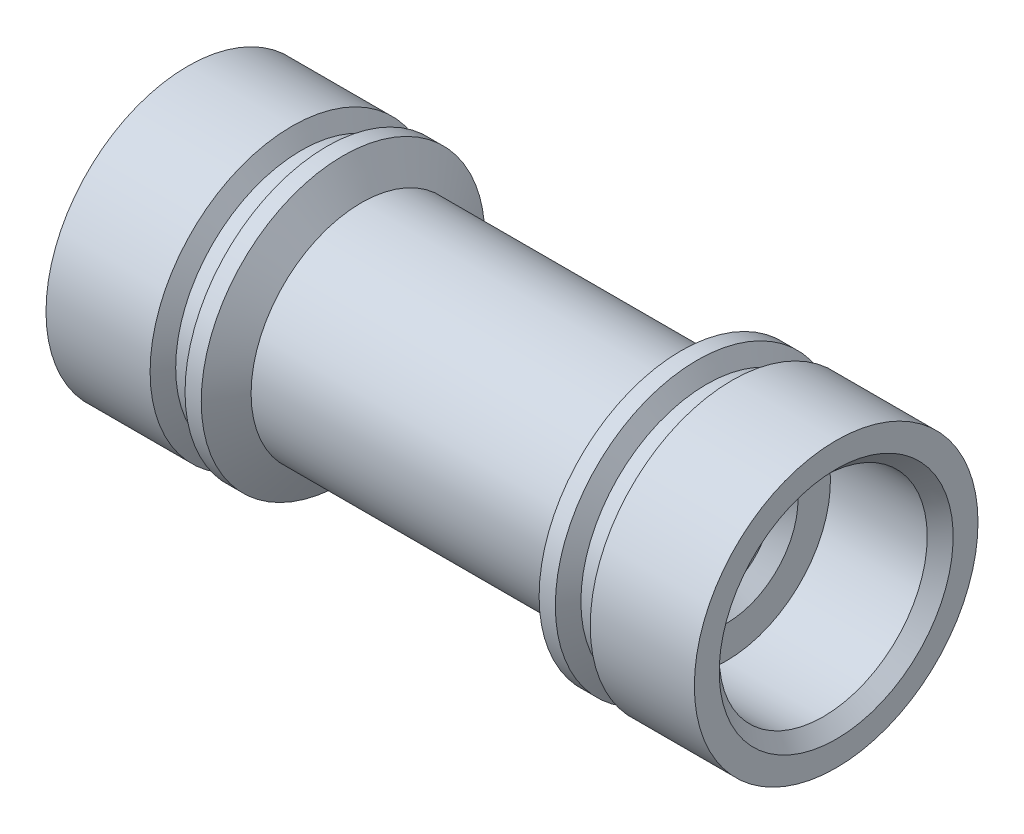
ISO-10303-21;
HEADER;
FILE_DESCRIPTION(('STEP AP214'),'2;1');
FILE_NAME('part.step','',(''),(''),'','','');
FILE_SCHEMA(('AUTOMOTIVE_DESIGN { 1 0 10303 214 1 1 1 1 }'));
ENDSEC;
DATA;
#1=APPLICATION_CONTEXT('core data for automotive mechanical design processes');
#2=APPLICATION_PROTOCOL_DEFINITION('international standard','automotive_design',2000,#1);
#3=PRODUCT_CONTEXT('',#1,'mechanical');
#4=PRODUCT('Part','Part','',(#3));
#5=PRODUCT_RELATED_PRODUCT_CATEGORY('part','',(#4));
#6=PRODUCT_DEFINITION_FORMATION('','',#4);
#7=PRODUCT_DEFINITION_CONTEXT('part definition',#1,'design');
#8=PRODUCT_DEFINITION('design','',#6,#7);
#9=PRODUCT_DEFINITION_SHAPE('','',#8);
#10=(LENGTH_UNIT() NAMED_UNIT(*) SI_UNIT(.MILLI.,.METRE.));
#11=(NAMED_UNIT(*) PLANE_ANGLE_UNIT() SI_UNIT($,.RADIAN.));
#12=(NAMED_UNIT(*) SI_UNIT($,.STERADIAN.) SOLID_ANGLE_UNIT());
#13=UNCERTAINTY_MEASURE_WITH_UNIT(LENGTH_MEASURE(1.E-05),#10,'distance_accuracy_value','');
#14=(GEOMETRIC_REPRESENTATION_CONTEXT(3) GLOBAL_UNCERTAINTY_ASSIGNED_CONTEXT((#13)) GLOBAL_UNIT_ASSIGNED_CONTEXT((#10,
#11,#12)) REPRESENTATION_CONTEXT('',''));
#15=CARTESIAN_POINT('',(0.,0.,0.));
#16=DIRECTION('',(0.,0.,1.));
#17=DIRECTION('',(1.,0.,0.));
#18=AXIS2_PLACEMENT_3D('',#15,#16,#17);
#19=CARTESIAN_POINT('',(-12.7,0.,0.));
#20=DIRECTION('',(-1.,0.,0.));
#21=DIRECTION('',(0.,-1.,0.));
#22=AXIS2_PLACEMENT_3D('',#19,#20,#21);
#23=CYLINDRICAL_SURFACE('',#22,1.905);
#24=CARTESIAN_POINT('',(-2.748,0.,0.));
#25=DIRECTION('',(-1.,0.,0.));
#26=DIRECTION('',(0.,-1.,0.));
#27=AXIS2_PLACEMENT_3D('',#24,#25,#26);
#28=CIRCLE('',#27,1.905);
#29=CARTESIAN_POINT('',(-2.748,-1.905,0.));
#30=VERTEX_POINT('',#29);
#31=EDGE_CURVE('E138',#30,#30,#28,.T.);
#32=ORIENTED_EDGE('',*,*,#31,.F.);
#33=EDGE_LOOP('',(#32));
#34=FACE_BOUND('',#33,.T.);
#35=CARTESIAN_POINT('',(-7.891999964,0.,0.));
#36=DIRECTION('',(-1.,0.,0.));
#37=DIRECTION('',(0.,-1.,0.));
#38=AXIS2_PLACEMENT_3D('',#35,#36,#37);
#39=CIRCLE('',#38,1.905);
#40=CARTESIAN_POINT('',(-7.891999964,-1.905,0.));
#41=VERTEX_POINT('',#40);
#42=EDGE_CURVE('E94',#41,#41,#39,.T.);
#43=ORIENTED_EDGE('',*,*,#42,.T.);
#44=EDGE_LOOP('',(#43));
#45=FACE_BOUND('',#44,.T.);
#46=ADVANCED_FACE('F49',(#34,#45),#23,.F.);
#47=CARTESIAN_POINT('',(-2.748,0.,0.));
#48=DIRECTION('',(-1.,0.,0.));
#49=DIRECTION('',(0.,-1.,0.));
#50=AXIS2_PLACEMENT_3D('',#47,#48,#49);
#51=CONICAL_SURFACE('',#50,1.905,0.78539816339745);
#52=CARTESIAN_POINT('',(-0.843000000000007,0.,0.));
#53=VERTEX_POINT('',#52);
#54=VERTEX_LOOP('',#53);
#55=FACE_BOUND('',#54,.T.);
#56=ORIENTED_EDGE('',*,*,#31,.T.);
#57=EDGE_LOOP('',(#56));
#58=FACE_BOUND('',#57,.T.);
#59=ADVANCED_FACE('F160',(#55,#58),#51,.F.);
#60=CARTESIAN_POINT('',(-12.7,0.,0.));
#61=DIRECTION('',(-1.,0.,0.));
#62=DIRECTION('',(0.,-1.,0.));
#63=AXIS2_PLACEMENT_3D('',#60,#61,#62);
#64=CYLINDRICAL_SURFACE('',#63,4.318);
#65=CARTESIAN_POINT('',(-5.90347860824054,0.,0.));
#66=DIRECTION('',(-1.,0.,0.));
#67=DIRECTION('',(0.,-1.,0.));
#68=AXIS2_PLACEMENT_3D('',#65,#66,#67);
#69=CIRCLE('',#68,4.318);
#70=CARTESIAN_POINT('',(-5.90347860824054,-4.318,0.));
#71=VERTEX_POINT('',#70);
#72=EDGE_CURVE('E134',#71,#71,#69,.T.);
#73=ORIENTED_EDGE('',*,*,#72,.F.);
#74=EDGE_LOOP('',(#73));
#75=FACE_BOUND('',#74,.T.);
#76=CARTESIAN_POINT('',(5.90347860824054,0.,0.));
#77=DIRECTION('',(-1.,0.,0.));
#78=DIRECTION('',(0.,-1.,0.));
#79=AXIS2_PLACEMENT_3D('',#76,#77,#78);
#80=CIRCLE('',#79,4.318);
#81=CARTESIAN_POINT('',(5.90347860824054,-4.318,0.));
#82=VERTEX_POINT('',#81);
#83=EDGE_CURVE('E77',#82,#82,#80,.T.);
#84=ORIENTED_EDGE('',*,*,#83,.T.);
#85=EDGE_LOOP('',(#84));
#86=FACE_BOUND('',#85,.T.);
#87=ADVANCED_FACE('F164',(#75,#86),#64,.T.);
#88=CARTESIAN_POINT('',(-6.61838257906459,0.,0.));
#89=DIRECTION('',(-1.,0.,0.));
#90=DIRECTION('',(0.,-1.,0.));
#91=AXIS2_PLACEMENT_3D('',#88,#89,#90);
#92=CONICAL_SURFACE('',#91,5.55625,1.0471975511966);
#93=ORIENTED_EDGE('',*,*,#72,.T.);
#94=EDGE_LOOP('',(#93));
#95=FACE_BOUND('',#94,.T.);
#96=CARTESIAN_POINT('',(-6.61838257906459,0.,0.));
#97=DIRECTION('',(-1.,0.,0.));
#98=DIRECTION('',(0.,-1.,0.));
#99=AXIS2_PLACEMENT_3D('',#96,#97,#98);
#100=CIRCLE('',#99,5.55625);
#101=CARTESIAN_POINT('',(-6.61838257906459,-5.55625,0.));
#102=VERTEX_POINT('',#101);
#103=EDGE_CURVE('E130',#102,#102,#100,.T.);
#104=ORIENTED_EDGE('',*,*,#103,.F.);
#105=EDGE_LOOP('',(#104));
#106=FACE_BOUND('',#105,.T.);
#107=ADVANCED_FACE('F171',(#95,#106),#92,.T.);
#108=CARTESIAN_POINT('',(-12.7,0.,0.));
#109=DIRECTION('',(-1.,0.,0.));
#110=DIRECTION('',(0.,-1.,0.));
#111=AXIS2_PLACEMENT_3D('',#108,#109,#110);
#112=CYLINDRICAL_SURFACE('',#111,5.55625);
#113=ORIENTED_EDGE('',*,*,#103,.T.);
#114=EDGE_LOOP('',(#113));
#115=FACE_BOUND('',#114,.T.);
#116=CARTESIAN_POINT('',(-7.25338257906459,0.,0.));
#117=DIRECTION('',(-1.,0.,0.));
#118=DIRECTION('',(0.,-1.,0.));
#119=AXIS2_PLACEMENT_3D('',#116,#117,#118);
#120=CIRCLE('',#119,5.55625);
#121=CARTESIAN_POINT('',(-7.25338257906459,-5.55625,0.));
#122=VERTEX_POINT('',#121);
#123=EDGE_CURVE('E126',#122,#122,#120,.T.);
#124=ORIENTED_EDGE('',*,*,#123,.F.);
#125=EDGE_LOOP('',(#124));
#126=FACE_BOUND('',#125,.T.);
#127=ADVANCED_FACE('F175',(#115,#126),#112,.T.);
#128=CARTESIAN_POINT('',(-7.62,0.,0.));
#129=DIRECTION('',(1.,0.,0.));
#130=DIRECTION('',(0.,1.,0.));
#131=AXIS2_PLACEMENT_3D('',#128,#129,#130);
#132=CONICAL_SURFACE('',#131,4.92125,1.0471975511966);
#133=ORIENTED_EDGE('',*,*,#123,.T.);
#134=EDGE_LOOP('',(#133));
#135=FACE_BOUND('',#134,.T.);
#136=CARTESIAN_POINT('',(-7.62,0.,0.));
#137=DIRECTION('',(-1.,0.,0.));
#138=DIRECTION('',(0.,-1.,0.));
#139=AXIS2_PLACEMENT_3D('',#136,#137,#138);
#140=CIRCLE('',#139,4.92125);
#141=CARTESIAN_POINT('',(-7.62,-4.92125,0.));
#142=VERTEX_POINT('',#141);
#143=EDGE_CURVE('E122',#142,#142,#140,.T.);
#144=ORIENTED_EDGE('',*,*,#143,.F.);
#145=EDGE_LOOP('',(#144));
#146=FACE_BOUND('',#145,.T.);
#147=ADVANCED_FACE('F179',(#135,#146),#132,.T.);
#148=CARTESIAN_POINT('',(-12.7,0.,0.));
#149=DIRECTION('',(-1.,0.,0.));
#150=DIRECTION('',(0.,-1.,0.));
#151=AXIS2_PLACEMENT_3D('',#148,#149,#150);
#152=CYLINDRICAL_SURFACE('',#151,4.92125);
#153=ORIENTED_EDGE('',*,*,#143,.T.);
#154=EDGE_LOOP('',(#153));
#155=FACE_BOUND('',#154,.T.);
#156=CARTESIAN_POINT('',(-8.255,0.,0.));
#157=DIRECTION('',(-1.,0.,0.));
#158=DIRECTION('',(0.,-1.,0.));
#159=AXIS2_PLACEMENT_3D('',#156,#157,#158);
#160=CIRCLE('',#159,4.92125);
#161=CARTESIAN_POINT('',(-8.255,-4.92125,0.));
#162=VERTEX_POINT('',#161);
#163=EDGE_CURVE('E118',#162,#162,#160,.T.);
#164=ORIENTED_EDGE('',*,*,#163,.F.);
#165=EDGE_LOOP('',(#164));
#166=FACE_BOUND('',#165,.T.);
#167=ADVANCED_FACE('F183',(#155,#166),#152,.T.);
#168=CARTESIAN_POINT('',(-8.62161742093541,0.,0.));
#169=DIRECTION('',(-1.,0.,0.));
#170=DIRECTION('',(0.,-1.,0.));
#171=AXIS2_PLACEMENT_3D('',#168,#169,#170);
#172=CONICAL_SURFACE('',#171,5.55625,1.0471975511966);
#173=ORIENTED_EDGE('',*,*,#163,.T.);
#174=EDGE_LOOP('',(#173));
#175=FACE_BOUND('',#174,.T.);
#176=CARTESIAN_POINT('',(-8.62161742093541,0.,0.));
#177=DIRECTION('',(-1.,0.,0.));
#178=DIRECTION('',(0.,-1.,0.));
#179=AXIS2_PLACEMENT_3D('',#176,#177,#178);
#180=CIRCLE('',#179,5.55625);
#181=CARTESIAN_POINT('',(-8.62161742093541,-5.55625,0.));
#182=VERTEX_POINT('',#181);
#183=EDGE_CURVE('E114',#182,#182,#180,.T.);
#184=ORIENTED_EDGE('',*,*,#183,.F.);
#185=EDGE_LOOP('',(#184));
#186=FACE_BOUND('',#185,.T.);
#187=ADVANCED_FACE('F187',(#175,#186),#172,.T.);
#188=CARTESIAN_POINT('',(-12.7,0.,0.));
#189=DIRECTION('',(-1.,0.,0.));
#190=DIRECTION('',(0.,-1.,0.));
#191=AXIS2_PLACEMENT_3D('',#188,#189,#190);
#192=CYLINDRICAL_SURFACE('',#191,5.55625);
#193=ORIENTED_EDGE('',*,*,#183,.T.);
#194=EDGE_LOOP('',(#193));
#195=FACE_BOUND('',#194,.T.);
#196=CARTESIAN_POINT('',(-12.7,0.,0.));
#197=DIRECTION('',(-1.,0.,0.));
#198=DIRECTION('',(0.,-1.,0.));
#199=AXIS2_PLACEMENT_3D('',#196,#197,#198);
#200=CIRCLE('',#199,5.55625);
#201=CARTESIAN_POINT('',(-12.7,-5.55625,0.));
#202=VERTEX_POINT('',#201);
#203=EDGE_CURVE('E110',#202,#202,#200,.T.);
#204=ORIENTED_EDGE('',*,*,#203,.F.);
#205=EDGE_LOOP('',(#204));
#206=FACE_BOUND('',#205,.T.);
#207=ADVANCED_FACE('F191',(#195,#206),#192,.T.);
#208=CARTESIAN_POINT('',(-12.7,0.,0.));
#209=DIRECTION('',(1.,0.,0.));
#210=DIRECTION('',(0.,1.,0.));
#211=AXIS2_PLACEMENT_3D('',#208,#209,#210);
#212=PLANE('',#211);
#213=CARTESIAN_POINT('',(-12.7,0.,0.));
#214=DIRECTION('',(1.,0.,0.));
#215=DIRECTION('',(0.,1.,0.));
#216=AXIS2_PLACEMENT_3D('',#213,#214,#215);
#217=CIRCLE('',#216,4.58300000000001);
#218=CARTESIAN_POINT('',(-12.7,4.58300000000001,0.));
#219=VERTEX_POINT('',#218);
#220=EDGE_CURVE('E11',#219,#219,#217,.T.);
#221=ORIENTED_EDGE('',*,*,#220,.T.);
#222=EDGE_LOOP('',(#221));
#223=FACE_BOUND('',#222,.T.);
#224=ORIENTED_EDGE('',*,*,#203,.T.);
#225=EDGE_LOOP('',(#224));
#226=FACE_BOUND('',#225,.T.);
#227=ADVANCED_FACE('F195',(#223,#226),#212,.F.);
#228=CARTESIAN_POINT('',(-12.7,0.,0.));
#229=DIRECTION('',(-1.,0.,0.));
#230=DIRECTION('',(0.,-1.,0.));
#231=AXIS2_PLACEMENT_3D('',#228,#229,#230);
#232=CYLINDRICAL_SURFACE('',#231,4.075);
#233=CARTESIAN_POINT('',(-12.192,0.,0.));
#234=DIRECTION('',(1.,0.,0.));
#235=DIRECTION('',(0.,1.,0.));
#236=AXIS2_PLACEMENT_3D('',#233,#234,#235);
#237=CIRCLE('',#236,4.075);
#238=CARTESIAN_POINT('',(-12.192,4.075,0.));
#239=VERTEX_POINT('',#238);
#240=EDGE_CURVE('E59',#239,#239,#237,.F.);
#241=ORIENTED_EDGE('',*,*,#240,.T.);
#242=EDGE_LOOP('',(#241));
#243=FACE_BOUND('',#242,.T.);
#244=CARTESIAN_POINT('',(-8.399999964,0.,0.));
#245=DIRECTION('',(-1.,0.,0.));
#246=DIRECTION('',(0.,-1.,0.));
#247=AXIS2_PLACEMENT_3D('',#244,#245,#246);
#248=CIRCLE('',#247,4.075);
#249=CARTESIAN_POINT('',(-8.399999964,-4.075,0.));
#250=VERTEX_POINT('',#249);
#251=EDGE_CURVE('E106',#250,#250,#248,.T.);
#252=ORIENTED_EDGE('',*,*,#251,.F.);
#253=EDGE_LOOP('',(#252));
#254=FACE_BOUND('',#253,.T.);
#255=ADVANCED_FACE('F145',(#243,#254),#232,.F.);
#256=CARTESIAN_POINT('',(-8.399999964,0.,0.));
#257=DIRECTION('',(1.,0.,0.));
#258=DIRECTION('',(0.,1.,0.));
#259=AXIS2_PLACEMENT_3D('',#256,#257,#258);
#260=PLANE('',#259);
#261=CARTESIAN_POINT('',(-8.399999964,0.,0.));
#262=DIRECTION('',(-1.,0.,0.));
#263=DIRECTION('',(0.,-1.,0.));
#264=AXIS2_PLACEMENT_3D('',#261,#262,#263);
#265=CIRCLE('',#264,2.805);
#266=CARTESIAN_POINT('',(-8.399999964,-2.805,0.));
#267=VERTEX_POINT('',#266);
#268=EDGE_CURVE('E102',#267,#267,#265,.T.);
#269=ORIENTED_EDGE('',*,*,#268,.F.);
#270=EDGE_LOOP('',(#269));
#271=FACE_BOUND('',#270,.T.);
#272=ORIENTED_EDGE('',*,*,#251,.T.);
#273=EDGE_LOOP('',(#272));
#274=FACE_BOUND('',#273,.T.);
#275=ADVANCED_FACE('F202',(#271,#274),#260,.F.);
#276=CARTESIAN_POINT('',(-8.399999964,0.,0.));
#277=DIRECTION('',(-1.,0.,0.));
#278=DIRECTION('',(0.,-1.,0.));
#279=AXIS2_PLACEMENT_3D('',#276,#277,#278);
#280=CONICAL_SURFACE('',#279,2.805,0.785398163397449);
#281=CARTESIAN_POINT('',(-7.891999964,0.,0.));
#282=DIRECTION('',(-1.,0.,0.));
#283=DIRECTION('',(0.,-1.,0.));
#284=AXIS2_PLACEMENT_3D('',#281,#282,#283);
#285=CIRCLE('',#284,2.297);
#286=CARTESIAN_POINT('',(-7.891999964,-2.297,0.));
#287=VERTEX_POINT('',#286);
#288=EDGE_CURVE('E98',#287,#287,#285,.T.);
#289=ORIENTED_EDGE('',*,*,#288,.F.);
#290=EDGE_LOOP('',(#289));
#291=FACE_BOUND('',#290,.T.);
#292=ORIENTED_EDGE('',*,*,#268,.T.);
#293=EDGE_LOOP('',(#292));
#294=FACE_BOUND('',#293,.T.);
#295=ADVANCED_FACE('F155',(#291,#294),#280,.F.);
#296=CARTESIAN_POINT('',(-7.891999964,0.,0.));
#297=DIRECTION('',(1.,0.,0.));
#298=DIRECTION('',(0.,1.,0.));
#299=AXIS2_PLACEMENT_3D('',#296,#297,#298);
#300=PLANE('',#299);
#301=ORIENTED_EDGE('',*,*,#42,.F.);
#302=EDGE_LOOP('',(#301));
#303=FACE_BOUND('',#302,.T.);
#304=ORIENTED_EDGE('',*,*,#288,.T.);
#305=EDGE_LOOP('',(#304));
#306=FACE_BOUND('',#305,.T.);
#307=ADVANCED_FACE('F149',(#303,#306),#300,.F.);
#308=CARTESIAN_POINT('',(-12.192,0.,0.));
#309=DIRECTION('',(-1.,0.,0.));
#310=DIRECTION('',(0.,-1.,0.));
#311=AXIS2_PLACEMENT_3D('',#308,#309,#310);
#312=CONICAL_SURFACE('',#311,4.075,0.785398163397452);
#313=ORIENTED_EDGE('',*,*,#220,.F.);
#314=EDGE_LOOP('',(#313));
#315=FACE_BOUND('',#314,.T.);
#316=ORIENTED_EDGE('',*,*,#240,.F.);
#317=EDGE_LOOP('',(#316));
#318=FACE_BOUND('',#317,.T.);
#319=ADVANCED_FACE('F52',(#315,#318),#312,.F.);
#320=CARTESIAN_POINT('',(12.7,0.,0.));
#321=DIRECTION('',(1.,0.,0.));
#322=DIRECTION('',(0.,-1.,0.));
#323=AXIS2_PLACEMENT_3D('',#320,#321,#322);
#324=CYLINDRICAL_SURFACE('',#323,1.905);
#325=CARTESIAN_POINT('',(2.748,0.,0.));
#326=DIRECTION('',(-1.,0.,0.));
#327=DIRECTION('',(0.,-1.,0.));
#328=AXIS2_PLACEMENT_3D('',#325,#326,#327);
#329=CIRCLE('',#328,1.905);
#330=CARTESIAN_POINT('',(2.748,-1.905,0.));
#331=VERTEX_POINT('',#330);
#332=EDGE_CURVE('E73',#331,#331,#329,.T.);
#333=ORIENTED_EDGE('',*,*,#332,.T.);
#334=EDGE_LOOP('',(#333));
#335=FACE_BOUND('',#334,.T.);
#336=CARTESIAN_POINT('',(7.891999964,0.,0.));
#337=DIRECTION('',(-1.,0.,0.));
#338=DIRECTION('',(0.,-1.,0.));
#339=AXIS2_PLACEMENT_3D('',#336,#337,#338);
#340=CIRCLE('',#339,1.905);
#341=CARTESIAN_POINT('',(7.891999964,-1.905,0.));
#342=VERTEX_POINT('',#341);
#343=EDGE_CURVE('E259',#342,#342,#340,.T.);
#344=ORIENTED_EDGE('',*,*,#343,.F.);
#345=EDGE_LOOP('',(#344));
#346=FACE_BOUND('',#345,.T.);
#347=ADVANCED_FACE('F69',(#335,#346),#324,.F.);
#348=CARTESIAN_POINT('',(2.748,0.,0.));
#349=DIRECTION('',(1.,0.,0.));
#350=DIRECTION('',(0.,-1.,0.));
#351=AXIS2_PLACEMENT_3D('',#348,#349,#350);
#352=CONICAL_SURFACE('',#351,1.905,0.78539816339745);
#353=CARTESIAN_POINT('',(0.843000000000007,0.,0.));
#354=VERTEX_POINT('',#353);
#355=VERTEX_LOOP('',#354);
#356=FACE_BOUND('',#355,.T.);
#357=ORIENTED_EDGE('',*,*,#332,.F.);
#358=EDGE_LOOP('',(#357));
#359=FACE_BOUND('',#358,.T.);
#360=ADVANCED_FACE('F65',(#356,#359),#352,.F.);
#361=CARTESIAN_POINT('',(6.61838257906459,0.,0.));
#362=DIRECTION('',(1.,0.,0.));
#363=DIRECTION('',(0.,-1.,0.));
#364=AXIS2_PLACEMENT_3D('',#361,#362,#363);
#365=CONICAL_SURFACE('',#364,5.55625,1.0471975511966);
#366=ORIENTED_EDGE('',*,*,#83,.F.);
#367=EDGE_LOOP('',(#366));
#368=FACE_BOUND('',#367,.T.);
#369=CARTESIAN_POINT('',(6.61838257906459,0.,0.));
#370=DIRECTION('',(-1.,0.,0.));
#371=DIRECTION('',(0.,-1.,0.));
#372=AXIS2_PLACEMENT_3D('',#369,#370,#371);
#373=CIRCLE('',#372,5.55625);
#374=CARTESIAN_POINT('',(6.61838257906459,-5.55625,0.));
#375=VERTEX_POINT('',#374);
#376=EDGE_CURVE('E87',#375,#375,#373,.T.);
#377=ORIENTED_EDGE('',*,*,#376,.T.);
#378=EDGE_LOOP('',(#377));
#379=FACE_BOUND('',#378,.T.);
#380=ADVANCED_FACE('F68',(#368,#379),#365,.T.);
#381=CARTESIAN_POINT('',(12.7,0.,0.));
#382=DIRECTION('',(1.,0.,0.));
#383=DIRECTION('',(0.,-1.,0.));
#384=AXIS2_PLACEMENT_3D('',#381,#382,#383);
#385=CYLINDRICAL_SURFACE('',#384,5.55625);
#386=ORIENTED_EDGE('',*,*,#376,.F.);
#387=EDGE_LOOP('',(#386));
#388=FACE_BOUND('',#387,.T.);
#389=CARTESIAN_POINT('',(7.25338257906459,0.,0.));
#390=DIRECTION('',(-1.,0.,0.));
#391=DIRECTION('',(0.,-1.,0.));
#392=AXIS2_PLACEMENT_3D('',#389,#390,#391);
#393=CIRCLE('',#392,5.55625);
#394=CARTESIAN_POINT('',(7.25338257906459,-5.55625,0.));
#395=VERTEX_POINT('',#394);
#396=EDGE_CURVE('E290',#395,#395,#393,.T.);
#397=ORIENTED_EDGE('',*,*,#396,.T.);
#398=EDGE_LOOP('',(#397));
#399=FACE_BOUND('',#398,.T.);
#400=ADVANCED_FACE('F216',(#388,#399),#385,.T.);
#401=CARTESIAN_POINT('',(7.62,0.,0.));
#402=DIRECTION('',(-1.,0.,0.));
#403=DIRECTION('',(0.,1.,0.));
#404=AXIS2_PLACEMENT_3D('',#401,#402,#403);
#405=CONICAL_SURFACE('',#404,4.92125,1.0471975511966);
#406=ORIENTED_EDGE('',*,*,#396,.F.);
#407=EDGE_LOOP('',(#406));
#408=FACE_BOUND('',#407,.T.);
#409=CARTESIAN_POINT('',(7.62,0.,0.));
#410=DIRECTION('',(-1.,0.,0.));
#411=DIRECTION('',(0.,-1.,0.));
#412=AXIS2_PLACEMENT_3D('',#409,#410,#411);
#413=CIRCLE('',#412,4.92125);
#414=CARTESIAN_POINT('',(7.62,-4.92125,0.));
#415=VERTEX_POINT('',#414);
#416=EDGE_CURVE('E286',#415,#415,#413,.T.);
#417=ORIENTED_EDGE('',*,*,#416,.T.);
#418=EDGE_LOOP('',(#417));
#419=FACE_BOUND('',#418,.T.);
#420=ADVANCED_FACE('F220',(#408,#419),#405,.T.);
#421=CARTESIAN_POINT('',(12.7,0.,0.));
#422=DIRECTION('',(1.,0.,0.));
#423=DIRECTION('',(0.,-1.,0.));
#424=AXIS2_PLACEMENT_3D('',#421,#422,#423);
#425=CYLINDRICAL_SURFACE('',#424,4.92125);
#426=ORIENTED_EDGE('',*,*,#416,.F.);
#427=EDGE_LOOP('',(#426));
#428=FACE_BOUND('',#427,.T.);
#429=CARTESIAN_POINT('',(8.255,0.,0.));
#430=DIRECTION('',(-1.,0.,0.));
#431=DIRECTION('',(0.,-1.,0.));
#432=AXIS2_PLACEMENT_3D('',#429,#430,#431);
#433=CIRCLE('',#432,4.92125);
#434=CARTESIAN_POINT('',(8.255,-4.92125,0.));
#435=VERTEX_POINT('',#434);
#436=EDGE_CURVE('E282',#435,#435,#433,.T.);
#437=ORIENTED_EDGE('',*,*,#436,.T.);
#438=EDGE_LOOP('',(#437));
#439=FACE_BOUND('',#438,.T.);
#440=ADVANCED_FACE('F224',(#428,#439),#425,.T.);
#441=CARTESIAN_POINT('',(8.62161742093541,0.,0.));
#442=DIRECTION('',(1.,0.,0.));
#443=DIRECTION('',(0.,-1.,0.));
#444=AXIS2_PLACEMENT_3D('',#441,#442,#443);
#445=CONICAL_SURFACE('',#444,5.55625,1.0471975511966);
#446=ORIENTED_EDGE('',*,*,#436,.F.);
#447=EDGE_LOOP('',(#446));
#448=FACE_BOUND('',#447,.T.);
#449=CARTESIAN_POINT('',(8.62161742093541,0.,0.));
#450=DIRECTION('',(-1.,0.,0.));
#451=DIRECTION('',(0.,-1.,0.));
#452=AXIS2_PLACEMENT_3D('',#449,#450,#451);
#453=CIRCLE('',#452,5.55625);
#454=CARTESIAN_POINT('',(8.62161742093541,-5.55625,0.));
#455=VERTEX_POINT('',#454);
#456=EDGE_CURVE('E279',#455,#455,#453,.T.);
#457=ORIENTED_EDGE('',*,*,#456,.T.);
#458=EDGE_LOOP('',(#457));
#459=FACE_BOUND('',#458,.T.);
#460=ADVANCED_FACE('F228',(#448,#459),#445,.T.);
#461=CARTESIAN_POINT('',(12.7,0.,0.));
#462=DIRECTION('',(1.,0.,0.));
#463=DIRECTION('',(0.,-1.,0.));
#464=AXIS2_PLACEMENT_3D('',#461,#462,#463);
#465=CYLINDRICAL_SURFACE('',#464,5.55625);
#466=ORIENTED_EDGE('',*,*,#456,.F.);
#467=EDGE_LOOP('',(#466));
#468=FACE_BOUND('',#467,.T.);
#469=CARTESIAN_POINT('',(12.7,0.,0.));
#470=DIRECTION('',(-1.,0.,0.));
#471=DIRECTION('',(0.,-1.,0.));
#472=AXIS2_PLACEMENT_3D('',#469,#470,#471);
#473=CIRCLE('',#472,5.55625);
#474=CARTESIAN_POINT('',(12.7,-5.55625,0.));
#475=VERTEX_POINT('',#474);
#476=EDGE_CURVE('E276',#475,#475,#473,.T.);
#477=ORIENTED_EDGE('',*,*,#476,.T.);
#478=EDGE_LOOP('',(#477));
#479=FACE_BOUND('',#478,.T.);
#480=ADVANCED_FACE('F232',(#468,#479),#465,.T.);
#481=CARTESIAN_POINT('',(12.7,0.,0.));
#482=DIRECTION('',(-1.,0.,0.));
#483=DIRECTION('',(0.,1.,0.));
#484=AXIS2_PLACEMENT_3D('',#481,#482,#483);
#485=PLANE('',#484);
#486=CARTESIAN_POINT('',(12.7,0.,0.));
#487=DIRECTION('',(1.,0.,0.));
#488=DIRECTION('',(0.,1.,0.));
#489=AXIS2_PLACEMENT_3D('',#486,#487,#488);
#490=CIRCLE('',#489,4.58300000000001);
#491=CARTESIAN_POINT('',(12.7,4.58300000000001,0.));
#492=VERTEX_POINT('',#491);
#493=EDGE_CURVE('E83',#492,#492,#490,.T.);
#494=ORIENTED_EDGE('',*,*,#493,.F.);
#495=EDGE_LOOP('',(#494));
#496=FACE_BOUND('',#495,.T.);
#497=ORIENTED_EDGE('',*,*,#476,.F.);
#498=EDGE_LOOP('',(#497));
#499=FACE_BOUND('',#498,.T.);
#500=ADVANCED_FACE('F236',(#496,#499),#485,.F.);
#501=CARTESIAN_POINT('',(12.7,0.,0.));
#502=DIRECTION('',(1.,0.,0.));
#503=DIRECTION('',(0.,-1.,0.));
#504=AXIS2_PLACEMENT_3D('',#501,#502,#503);
#505=CYLINDRICAL_SURFACE('',#504,4.075);
#506=CARTESIAN_POINT('',(12.192,0.,0.));
#507=DIRECTION('',(1.,0.,0.));
#508=DIRECTION('',(0.,1.,0.));
#509=AXIS2_PLACEMENT_3D('',#506,#507,#508);
#510=CIRCLE('',#509,4.075);
#511=CARTESIAN_POINT('',(12.192,4.075,0.));
#512=VERTEX_POINT('',#511);
#513=EDGE_CURVE('E76',#512,#512,#510,.F.);
#514=ORIENTED_EDGE('',*,*,#513,.F.);
#515=EDGE_LOOP('',(#514));
#516=FACE_BOUND('',#515,.T.);
#517=CARTESIAN_POINT('',(8.399999964,0.,0.));
#518=DIRECTION('',(-1.,0.,0.));
#519=DIRECTION('',(0.,-1.,0.));
#520=AXIS2_PLACEMENT_3D('',#517,#518,#519);
#521=CIRCLE('',#520,4.075);
#522=CARTESIAN_POINT('',(8.399999964,-4.075,0.));
#523=VERTEX_POINT('',#522);
#524=EDGE_CURVE('E268',#523,#523,#521,.T.);
#525=ORIENTED_EDGE('',*,*,#524,.T.);
#526=EDGE_LOOP('',(#525));
#527=FACE_BOUND('',#526,.T.);
#528=ADVANCED_FACE('F240',(#516,#527),#505,.F.);
#529=CARTESIAN_POINT('',(8.399999964,0.,0.));
#530=DIRECTION('',(-1.,0.,0.));
#531=DIRECTION('',(0.,1.,0.));
#532=AXIS2_PLACEMENT_3D('',#529,#530,#531);
#533=PLANE('',#532);
#534=CARTESIAN_POINT('',(8.399999964,0.,0.));
#535=DIRECTION('',(-1.,0.,0.));
#536=DIRECTION('',(0.,-1.,0.));
#537=AXIS2_PLACEMENT_3D('',#534,#535,#536);
#538=CIRCLE('',#537,2.805);
#539=CARTESIAN_POINT('',(8.399999964,-2.805,0.));
#540=VERTEX_POINT('',#539);
#541=EDGE_CURVE('E264',#540,#540,#538,.T.);
#542=ORIENTED_EDGE('',*,*,#541,.T.);
#543=EDGE_LOOP('',(#542));
#544=FACE_BOUND('',#543,.T.);
#545=ORIENTED_EDGE('',*,*,#524,.F.);
#546=EDGE_LOOP('',(#545));
#547=FACE_BOUND('',#546,.T.);
#548=ADVANCED_FACE('F244',(#544,#547),#533,.F.);
#549=CARTESIAN_POINT('',(8.399999964,0.,0.));
#550=DIRECTION('',(1.,0.,0.));
#551=DIRECTION('',(0.,-1.,0.));
#552=AXIS2_PLACEMENT_3D('',#549,#550,#551);
#553=CONICAL_SURFACE('',#552,2.805,0.785398163397449);
#554=CARTESIAN_POINT('',(7.891999964,0.,0.));
#555=DIRECTION('',(-1.,0.,0.));
#556=DIRECTION('',(0.,-1.,0.));
#557=AXIS2_PLACEMENT_3D('',#554,#555,#556);
#558=CIRCLE('',#557,2.297);
#559=CARTESIAN_POINT('',(7.891999964,-2.297,0.));
#560=VERTEX_POINT('',#559);
#561=EDGE_CURVE('E262',#560,#560,#558,.T.);
#562=ORIENTED_EDGE('',*,*,#561,.T.);
#563=EDGE_LOOP('',(#562));
#564=FACE_BOUND('',#563,.T.);
#565=ORIENTED_EDGE('',*,*,#541,.F.);
#566=EDGE_LOOP('',(#565));
#567=FACE_BOUND('',#566,.T.);
#568=ADVANCED_FACE('F248',(#564,#567),#553,.F.);
#569=CARTESIAN_POINT('',(7.891999964,0.,0.));
#570=DIRECTION('',(-1.,0.,0.));
#571=DIRECTION('',(0.,1.,0.));
#572=AXIS2_PLACEMENT_3D('',#569,#570,#571);
#573=PLANE('',#572);
#574=ORIENTED_EDGE('',*,*,#343,.T.);
#575=EDGE_LOOP('',(#574));
#576=FACE_BOUND('',#575,.T.);
#577=ORIENTED_EDGE('',*,*,#561,.F.);
#578=EDGE_LOOP('',(#577));
#579=FACE_BOUND('',#578,.T.);
#580=ADVANCED_FACE('F211',(#576,#579),#573,.F.);
#581=CARTESIAN_POINT('',(12.192,0.,0.));
#582=DIRECTION('',(1.,0.,0.));
#583=DIRECTION('',(0.,-1.,0.));
#584=AXIS2_PLACEMENT_3D('',#581,#582,#583);
#585=CONICAL_SURFACE('',#584,4.075,0.785398163397452);
#586=ORIENTED_EDGE('',*,*,#493,.T.);
#587=EDGE_LOOP('',(#586));
#588=FACE_BOUND('',#587,.T.);
#589=ORIENTED_EDGE('',*,*,#513,.T.);
#590=EDGE_LOOP('',(#589));
#591=FACE_BOUND('',#590,.T.);
#592=ADVANCED_FACE('F209',(#588,#591),#585,.F.);
#593=CLOSED_SHELL('',(#46,#59,#87,#107,#127,#147,#167,#187,#207,#227,#255,#275,#295,#307,#319,
#347,#360,#380,#400,#420,#440,#460,#480,#500,#528,#548,#568,#580,#592));
#594=MANIFOLD_SOLID_BREP('B2',#593);
#595=ADVANCED_BREP_SHAPE_REPRESENTATION('',(#18,#594),#14);
#596=SHAPE_DEFINITION_REPRESENTATION(#9,#595);
ENDSEC;
END-ISO-10303-21;
